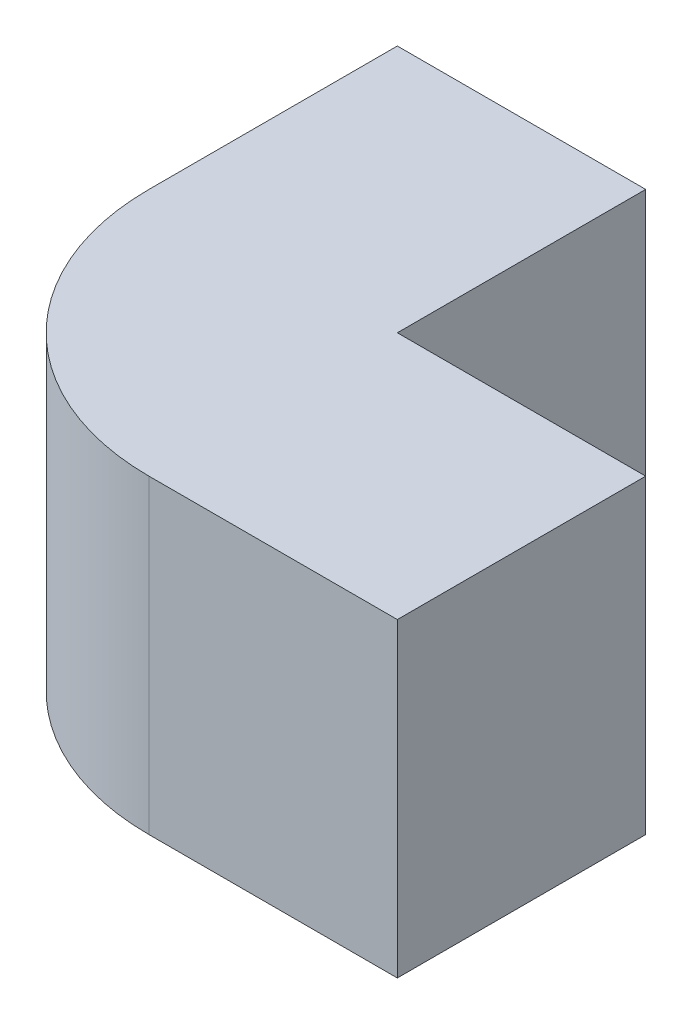
ISO-10303-21;
HEADER;
FILE_DESCRIPTION(('STEP AP214'),'2;1');
FILE_NAME('part.step','',(''),(''),'','','');
FILE_SCHEMA(('AUTOMOTIVE_DESIGN { 1 0 10303 214 1 1 1 1 }'));
ENDSEC;
DATA;
#1=APPLICATION_CONTEXT('core data for automotive mechanical design processes');
#2=APPLICATION_PROTOCOL_DEFINITION('international standard','automotive_design',2000,#1);
#3=PRODUCT_CONTEXT('',#1,'mechanical');
#4=PRODUCT('Part','Part','',(#3));
#5=PRODUCT_RELATED_PRODUCT_CATEGORY('part','',(#4));
#6=PRODUCT_DEFINITION_FORMATION('','',#4);
#7=PRODUCT_DEFINITION_CONTEXT('part definition',#1,'design');
#8=PRODUCT_DEFINITION('design','',#6,#7);
#9=PRODUCT_DEFINITION_SHAPE('','',#8);
#10=(LENGTH_UNIT() NAMED_UNIT(*) SI_UNIT(.MILLI.,.METRE.));
#11=(NAMED_UNIT(*) PLANE_ANGLE_UNIT() SI_UNIT($,.RADIAN.));
#12=(NAMED_UNIT(*) SI_UNIT($,.STERADIAN.) SOLID_ANGLE_UNIT());
#13=UNCERTAINTY_MEASURE_WITH_UNIT(LENGTH_MEASURE(1.E-05),#10,'distance_accuracy_value','');
#14=(GEOMETRIC_REPRESENTATION_CONTEXT(3) GLOBAL_UNCERTAINTY_ASSIGNED_CONTEXT((#13)) GLOBAL_UNIT_ASSIGNED_CONTEXT((#10,
#11,#12)) REPRESENTATION_CONTEXT('',''));
#15=CARTESIAN_POINT('',(0.,0.,0.));
#16=DIRECTION('',(0.,0.,1.));
#17=DIRECTION('',(1.,0.,0.));
#18=AXIS2_PLACEMENT_3D('',#15,#16,#17);
#19=CARTESIAN_POINT('',(4.,0.,8.));
#20=DIRECTION('',(-1.,0.,0.));
#21=DIRECTION('',(0.,-1.,0.));
#22=AXIS2_PLACEMENT_3D('',#19,#20,#21);
#23=PLANE('',#22);
#24=DIRECTION('',(0.,1.,0.));
#25=VECTOR('',#24,1.);
#26=CARTESIAN_POINT('',(4.,0.,4.));
#27=LINE('',#26,#25);
#28=CARTESIAN_POINT('',(4.,-5.,4.));
#29=VERTEX_POINT('',#28);
#30=CARTESIAN_POINT('',(4.,0.,4.));
#31=VERTEX_POINT('',#30);
#32=EDGE_CURVE('E123',#29,#31,#27,.T.);
#33=ORIENTED_EDGE('',*,*,#32,.F.);
#34=DIRECTION('',(0.,0.,-1.));
#35=VECTOR('',#34,1.);
#36=CARTESIAN_POINT('',(4.,-5.,8.));
#37=LINE('',#36,#35);
#38=CARTESIAN_POINT('',(4.,-5.,0.));
#39=VERTEX_POINT('',#38);
#40=EDGE_CURVE('E150',#29,#39,#37,.T.);
#41=ORIENTED_EDGE('',*,*,#40,.T.);
#42=DIRECTION('',(0.,1.,0.));
#43=VECTOR('',#42,1.);
#44=CARTESIAN_POINT('',(4.,0.,0.));
#45=LINE('',#44,#43);
#46=CARTESIAN_POINT('',(4.,0.,0.));
#47=VERTEX_POINT('',#46);
#48=EDGE_CURVE('E142',#39,#47,#45,.T.);
#49=ORIENTED_EDGE('',*,*,#48,.T.);
#50=DIRECTION('',(0.,0.,-1.));
#51=VECTOR('',#50,1.);
#52=CARTESIAN_POINT('',(4.,0.,8.));
#53=LINE('',#52,#51);
#54=EDGE_CURVE('E148',#31,#47,#53,.T.);
#55=ORIENTED_EDGE('',*,*,#54,.F.);
#56=EDGE_LOOP('',(#33,#41,#49,#55));
#57=FACE_BOUND('',#56,.T.);
#58=ADVANCED_FACE('F41',(#57),#23,.F.);
#59=CARTESIAN_POINT('',(0.,0.,8.));
#60=DIRECTION('',(1.,0.,0.));
#61=DIRECTION('',(0.,1.,0.));
#62=AXIS2_PLACEMENT_3D('',#59,#60,#61);
#63=PLANE('',#62);
#64=DIRECTION('',(0.,0.,-1.));
#65=VECTOR('',#64,1.);
#66=CARTESIAN_POINT('',(0.,-5.,8.));
#67=LINE('',#66,#65);
#68=CARTESIAN_POINT('',(0.,-5.,4.));
#69=VERTEX_POINT('',#68);
#70=CARTESIAN_POINT('',(0.,-5.,0.));
#71=VERTEX_POINT('',#70);
#72=EDGE_CURVE('E152',#69,#71,#67,.T.);
#73=ORIENTED_EDGE('',*,*,#72,.F.);
#74=DIRECTION('',(0.,-1.,0.));
#75=VECTOR('',#74,1.);
#76=CARTESIAN_POINT('',(0.,0.,4.));
#77=LINE('',#76,#75);
#78=CARTESIAN_POINT('',(0.,0.,4.));
#79=VERTEX_POINT('',#78);
#80=EDGE_CURVE('E49',#69,#79,#77,.F.);
#81=ORIENTED_EDGE('',*,*,#80,.T.);
#82=DIRECTION('',(0.,0.,-1.));
#83=VECTOR('',#82,1.);
#84=CARTESIAN_POINT('',(0.,0.,8.));
#85=LINE('',#84,#83);
#86=CARTESIAN_POINT('',(0.,0.,0.));
#87=VERTEX_POINT('',#86);
#88=EDGE_CURVE('E136',#79,#87,#85,.T.);
#89=ORIENTED_EDGE('',*,*,#88,.T.);
#90=DIRECTION('',(0.,-1.,0.));
#91=VECTOR('',#90,1.);
#92=CARTESIAN_POINT('',(0.,0.,0.));
#93=LINE('',#92,#91);
#94=EDGE_CURVE('E133',#87,#71,#93,.T.);
#95=ORIENTED_EDGE('',*,*,#94,.T.);
#96=EDGE_LOOP('',(#73,#81,#89,#95));
#97=FACE_BOUND('',#96,.T.);
#98=ADVANCED_FACE('F161',(#97),#63,.F.);
#99=CARTESIAN_POINT('',(0.,-5.,8.));
#100=DIRECTION('',(0.,1.,0.));
#101=DIRECTION('',(0.,0.,1.));
#102=AXIS2_PLACEMENT_3D('',#99,#100,#101);
#103=PLANE('',#102);
#104=DIRECTION('',(1.,0.,0.));
#105=VECTOR('',#104,1.);
#106=CARTESIAN_POINT('',(0.,-5.,8.));
#107=LINE('',#106,#105);
#108=CARTESIAN_POINT('',(4.,-5.,8.));
#109=VERTEX_POINT('',#108);
#110=CARTESIAN_POINT('',(8.,-5.,8.));
#111=VERTEX_POINT('',#110);
#112=EDGE_CURVE('E98',#109,#111,#107,.T.);
#113=ORIENTED_EDGE('',*,*,#112,.F.);
#114=CARTESIAN_POINT('',(4.,-5.,4.));
#115=DIRECTION('',(0.,1.,0.));
#116=DIRECTION('',(0.,0.,1.));
#117=AXIS2_PLACEMENT_3D('',#114,#115,#116);
#118=CIRCLE('',#117,4.);
#119=EDGE_CURVE('E63',#109,#69,#118,.F.);
#120=ORIENTED_EDGE('',*,*,#119,.T.);
#121=ORIENTED_EDGE('',*,*,#72,.T.);
#122=DIRECTION('',(1.,0.,0.));
#123=VECTOR('',#122,1.);
#124=CARTESIAN_POINT('',(0.,-5.,0.));
#125=LINE('',#124,#123);
#126=EDGE_CURVE('E139',#71,#39,#125,.T.);
#127=ORIENTED_EDGE('',*,*,#126,.T.);
#128=ORIENTED_EDGE('',*,*,#40,.F.);
#129=DIRECTION('',(-1.,0.,0.));
#130=VECTOR('',#129,1.);
#131=CARTESIAN_POINT('',(8.,-5.,4.));
#132=LINE('',#131,#130);
#133=CARTESIAN_POINT('',(8.,-5.,4.));
#134=VERTEX_POINT('',#133);
#135=EDGE_CURVE('E114',#134,#29,#132,.T.);
#136=ORIENTED_EDGE('',*,*,#135,.F.);
#137=DIRECTION('',(0.,0.,-1.));
#138=VECTOR('',#137,1.);
#139=CARTESIAN_POINT('',(8.,-5.,8.));
#140=LINE('',#139,#138);
#141=EDGE_CURVE('E110',#111,#134,#140,.T.);
#142=ORIENTED_EDGE('',*,*,#141,.F.);
#143=EDGE_LOOP('',(#113,#120,#121,#127,#128,#136,#142));
#144=FACE_BOUND('',#143,.T.);
#145=ADVANCED_FACE('F111',(#144),#103,.F.);
#146=CARTESIAN_POINT('',(0.,0.,8.));
#147=DIRECTION('',(0.,-1.,0.));
#148=DIRECTION('',(0.,0.,-1.));
#149=AXIS2_PLACEMENT_3D('',#146,#147,#148);
#150=PLANE('',#149);
#151=ORIENTED_EDGE('',*,*,#88,.F.);
#152=CARTESIAN_POINT('',(4.,0.,4.));
#153=DIRECTION('',(0.,-1.,0.));
#154=DIRECTION('',(0.,0.,-1.));
#155=AXIS2_PLACEMENT_3D('',#152,#153,#154);
#156=CIRCLE('',#155,4.);
#157=CARTESIAN_POINT('',(4.,0.,8.));
#158=VERTEX_POINT('',#157);
#159=EDGE_CURVE('E11',#79,#158,#156,.F.);
#160=ORIENTED_EDGE('',*,*,#159,.T.);
#161=DIRECTION('',(-1.,0.,0.));
#162=VECTOR('',#161,1.);
#163=CARTESIAN_POINT('',(0.,0.,8.));
#164=LINE('',#163,#162);
#165=CARTESIAN_POINT('',(8.,0.,8.));
#166=VERTEX_POINT('',#165);
#167=EDGE_CURVE('E106',#166,#158,#164,.T.);
#168=ORIENTED_EDGE('',*,*,#167,.F.);
#169=DIRECTION('',(0.,0.,1.));
#170=VECTOR('',#169,1.);
#171=CARTESIAN_POINT('',(8.,0.,8.));
#172=LINE('',#171,#170);
#173=CARTESIAN_POINT('',(8.,0.,4.));
#174=VERTEX_POINT('',#173);
#175=EDGE_CURVE('E122',#174,#166,#172,.T.);
#176=ORIENTED_EDGE('',*,*,#175,.F.);
#177=DIRECTION('',(-1.,0.,0.));
#178=VECTOR('',#177,1.);
#179=CARTESIAN_POINT('',(8.,0.,4.));
#180=LINE('',#179,#178);
#181=EDGE_CURVE('E129',#174,#31,#180,.T.);
#182=ORIENTED_EDGE('',*,*,#181,.T.);
#183=ORIENTED_EDGE('',*,*,#54,.T.);
#184=DIRECTION('',(-1.,0.,0.));
#185=VECTOR('',#184,1.);
#186=CARTESIAN_POINT('',(0.,0.,0.));
#187=LINE('',#186,#185);
#188=EDGE_CURVE('E107',#47,#87,#187,.T.);
#189=ORIENTED_EDGE('',*,*,#188,.T.);
#190=EDGE_LOOP('',(#151,#160,#168,#176,#182,#183,#189));
#191=FACE_BOUND('',#190,.T.);
#192=ADVANCED_FACE('F164',(#191),#150,.F.);
#193=CARTESIAN_POINT('',(0.,0.,8.));
#194=DIRECTION('',(0.,0.,1.));
#195=DIRECTION('',(1.,0.,0.));
#196=AXIS2_PLACEMENT_3D('',#193,#194,#195);
#197=PLANE('',#196);
#198=ORIENTED_EDGE('',*,*,#167,.T.);
#199=DIRECTION('',(0.,-1.,0.));
#200=VECTOR('',#199,1.);
#201=CARTESIAN_POINT('',(4.,-5.,8.));
#202=LINE('',#201,#200);
#203=EDGE_CURVE('E105',#158,#109,#202,.T.);
#204=ORIENTED_EDGE('',*,*,#203,.T.);
#205=ORIENTED_EDGE('',*,*,#112,.T.);
#206=DIRECTION('',(0.,-1.,0.));
#207=VECTOR('',#206,1.);
#208=CARTESIAN_POINT('',(8.,0.,8.));
#209=LINE('',#208,#207);
#210=EDGE_CURVE('E103',#166,#111,#209,.T.);
#211=ORIENTED_EDGE('',*,*,#210,.F.);
#212=EDGE_LOOP('',(#198,#204,#205,#211));
#213=FACE_BOUND('',#212,.T.);
#214=ADVANCED_FACE('F101',(#213),#197,.T.);
#215=CARTESIAN_POINT('',(0.,0.,0.));
#216=DIRECTION('',(0.,0.,1.));
#217=DIRECTION('',(1.,0.,0.));
#218=AXIS2_PLACEMENT_3D('',#215,#216,#217);
#219=PLANE('',#218);
#220=ORIENTED_EDGE('',*,*,#94,.F.);
#221=ORIENTED_EDGE('',*,*,#188,.F.);
#222=ORIENTED_EDGE('',*,*,#48,.F.);
#223=ORIENTED_EDGE('',*,*,#126,.F.);
#224=EDGE_LOOP('',(#220,#221,#222,#223));
#225=FACE_BOUND('',#224,.T.);
#226=ADVANCED_FACE('F159',(#225),#219,.F.);
#227=CARTESIAN_POINT('',(8.,0.,4.));
#228=DIRECTION('',(0.,0.,1.));
#229=DIRECTION('',(0.,-1.,0.));
#230=AXIS2_PLACEMENT_3D('',#227,#228,#229);
#231=PLANE('',#230);
#232=ORIENTED_EDGE('',*,*,#32,.T.);
#233=ORIENTED_EDGE('',*,*,#181,.F.);
#234=DIRECTION('',(0.,1.,0.));
#235=VECTOR('',#234,1.);
#236=CARTESIAN_POINT('',(8.,0.,4.));
#237=LINE('',#236,#235);
#238=EDGE_CURVE('E117',#134,#174,#237,.T.);
#239=ORIENTED_EDGE('',*,*,#238,.F.);
#240=ORIENTED_EDGE('',*,*,#135,.T.);
#241=EDGE_LOOP('',(#232,#233,#239,#240));
#242=FACE_BOUND('',#241,.T.);
#243=ADVANCED_FACE('F168',(#242),#231,.F.);
#244=CARTESIAN_POINT('',(8.,0.,0.));
#245=DIRECTION('',(1.,0.,0.));
#246=DIRECTION('',(0.,1.,0.));
#247=AXIS2_PLACEMENT_3D('',#244,#245,#246);
#248=PLANE('',#247);
#249=ORIENTED_EDGE('',*,*,#210,.T.);
#250=ORIENTED_EDGE('',*,*,#141,.T.);
#251=ORIENTED_EDGE('',*,*,#238,.T.);
#252=ORIENTED_EDGE('',*,*,#175,.T.);
#253=EDGE_LOOP('',(#249,#250,#251,#252));
#254=FACE_BOUND('',#253,.T.);
#255=ADVANCED_FACE('F120',(#254),#248,.T.);
#256=CARTESIAN_POINT('',(4.,0.,4.));
#257=DIRECTION('',(0.,1.,0.));
#258=DIRECTION('',(-1.,0.,0.));
#259=AXIS2_PLACEMENT_3D('',#256,#257,#258);
#260=CYLINDRICAL_SURFACE('',#259,4.);
#261=ORIENTED_EDGE('',*,*,#159,.F.);
#262=ORIENTED_EDGE('',*,*,#80,.F.);
#263=ORIENTED_EDGE('',*,*,#119,.F.);
#264=ORIENTED_EDGE('',*,*,#203,.F.);
#265=EDGE_LOOP('',(#261,#262,#263,#264));
#266=FACE_BOUND('',#265,.T.);
#267=ADVANCED_FACE('F43',(#266),#260,.T.);
#268=CLOSED_SHELL('',(#58,#98,#145,#192,#214,#226,#243,#255,#267));
#269=MANIFOLD_SOLID_BREP('B2',#268);
#270=ADVANCED_BREP_SHAPE_REPRESENTATION('',(#18,#269),#14);
#271=SHAPE_DEFINITION_REPRESENTATION(#9,#270);
ENDSEC;
END-ISO-10303-21;
